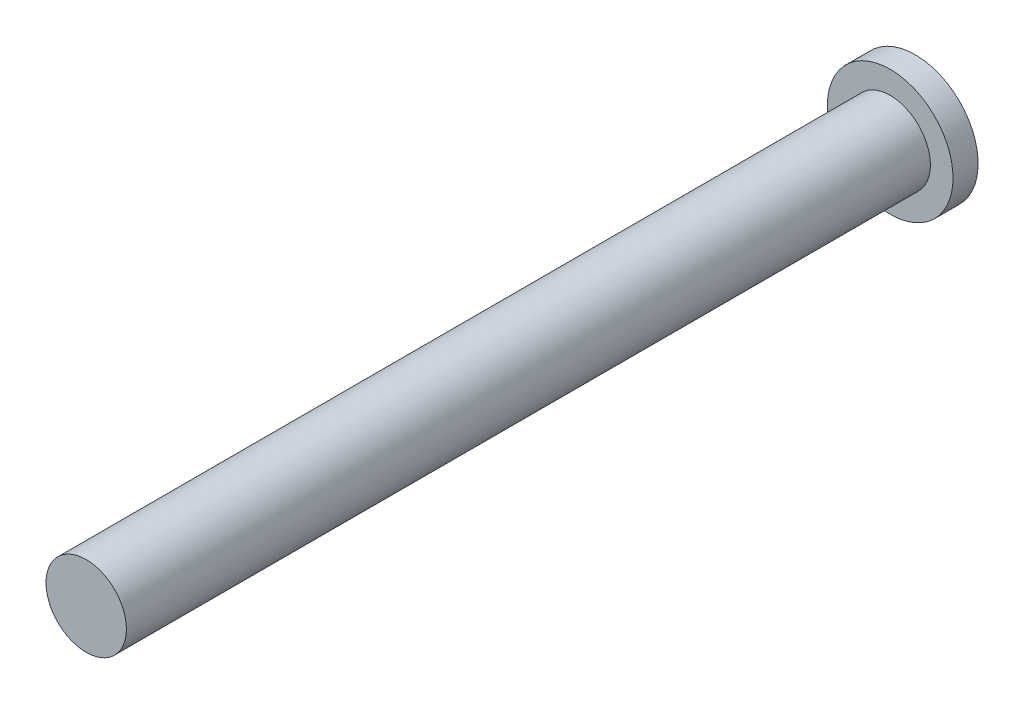
ISO-10303-21;
HEADER;
FILE_DESCRIPTION(('STEP AP214'),'2;1');
FILE_NAME('part.step','',(''),(''),'','','');
FILE_SCHEMA(('AUTOMOTIVE_DESIGN { 1 0 10303 214 1 1 1 1 }'));
ENDSEC;
DATA;
#1=APPLICATION_CONTEXT('core data for automotive mechanical design processes');
#2=APPLICATION_PROTOCOL_DEFINITION('international standard','automotive_design',2000,#1);
#3=PRODUCT_CONTEXT('',#1,'mechanical');
#4=PRODUCT('Part','Part','',(#3));
#5=PRODUCT_RELATED_PRODUCT_CATEGORY('part','',(#4));
#6=PRODUCT_DEFINITION_FORMATION('','',#4);
#7=PRODUCT_DEFINITION_CONTEXT('part definition',#1,'design');
#8=PRODUCT_DEFINITION('design','',#6,#7);
#9=PRODUCT_DEFINITION_SHAPE('','',#8);
#10=(LENGTH_UNIT() NAMED_UNIT(*) SI_UNIT(.MILLI.,.METRE.));
#11=(NAMED_UNIT(*) PLANE_ANGLE_UNIT() SI_UNIT($,.RADIAN.));
#12=(NAMED_UNIT(*) SI_UNIT($,.STERADIAN.) SOLID_ANGLE_UNIT());
#13=UNCERTAINTY_MEASURE_WITH_UNIT(LENGTH_MEASURE(1.E-05),#10,'distance_accuracy_value','');
#14=(GEOMETRIC_REPRESENTATION_CONTEXT(3) GLOBAL_UNCERTAINTY_ASSIGNED_CONTEXT((#13)) GLOBAL_UNIT_ASSIGNED_CONTEXT((#10,
#11,#12)) REPRESENTATION_CONTEXT('',''));
#15=CARTESIAN_POINT('',(0.,0.,0.));
#16=DIRECTION('',(0.,0.,1.));
#17=DIRECTION('',(1.,0.,0.));
#18=AXIS2_PLACEMENT_3D('',#15,#16,#17);
#19=CARTESIAN_POINT('',(0.,0.,32.));
#20=DIRECTION('',(0.,0.,-1.));
#21=DIRECTION('',(-1.,0.,0.));
#22=AXIS2_PLACEMENT_3D('',#19,#20,#21);
#23=CYLINDRICAL_SURFACE('',#22,1.6);
#24=CARTESIAN_POINT('',(0.,0.,32.));
#25=DIRECTION('',(0.,0.,1.));
#26=DIRECTION('',(1.,0.,0.));
#27=AXIS2_PLACEMENT_3D('',#24,#25,#26);
#28=CIRCLE('',#27,1.6);
#29=CARTESIAN_POINT('',(1.6,0.,32.));
#30=VERTEX_POINT('',#29);
#31=EDGE_CURVE('E10',#30,#30,#28,.T.);
#32=ORIENTED_EDGE('',*,*,#31,.F.);
#33=EDGE_LOOP('',(#32));
#34=FACE_BOUND('',#33,.T.);
#35=CARTESIAN_POINT('',(0.,0.,0.));
#36=DIRECTION('',(0.,0.,-1.));
#37=DIRECTION('',(-1.,0.,0.));
#38=AXIS2_PLACEMENT_3D('',#35,#36,#37);
#39=CIRCLE('',#38,1.6);
#40=CARTESIAN_POINT('',(-1.6,0.,0.));
#41=VERTEX_POINT('',#40);
#42=EDGE_CURVE('E37',#41,#41,#39,.T.);
#43=ORIENTED_EDGE('',*,*,#42,.F.);
#44=EDGE_LOOP('',(#43));
#45=FACE_BOUND('',#44,.T.);
#46=ADVANCED_FACE('F31',(#34,#45),#23,.T.);
#47=CARTESIAN_POINT('',(0.,0.,32.));
#48=DIRECTION('',(0.,0.,1.));
#49=DIRECTION('',(1.,0.,0.));
#50=AXIS2_PLACEMENT_3D('',#47,#48,#49);
#51=PLANE('',#50);
#52=ORIENTED_EDGE('',*,*,#31,.T.);
#53=EDGE_LOOP('',(#52));
#54=FACE_BOUND('',#53,.T.);
#55=ADVANCED_FACE('F64',(#54),#51,.T.);
#56=CARTESIAN_POINT('',(0.,0.,-1.));
#57=DIRECTION('',(0.,0.,1.));
#58=DIRECTION('',(1.,0.,0.));
#59=AXIS2_PLACEMENT_3D('',#56,#57,#58);
#60=CYLINDRICAL_SURFACE('',#59,2.5);
#61=CARTESIAN_POINT('',(0.,0.,-1.));
#62=DIRECTION('',(0.,0.,-1.));
#63=DIRECTION('',(-1.,0.,0.));
#64=AXIS2_PLACEMENT_3D('',#61,#62,#63);
#65=CIRCLE('',#64,2.5);
#66=CARTESIAN_POINT('',(-2.5,0.,-1.));
#67=VERTEX_POINT('',#66);
#68=EDGE_CURVE('E41',#67,#67,#65,.T.);
#69=ORIENTED_EDGE('',*,*,#68,.F.);
#70=EDGE_LOOP('',(#69));
#71=FACE_BOUND('',#70,.T.);
#72=CARTESIAN_POINT('',(0.,0.,0.));
#73=DIRECTION('',(0.,0.,-1.));
#74=DIRECTION('',(-1.,0.,0.));
#75=AXIS2_PLACEMENT_3D('',#72,#73,#74);
#76=CIRCLE('',#75,2.5);
#77=CARTESIAN_POINT('',(-2.5,0.,0.));
#78=VERTEX_POINT('',#77);
#79=EDGE_CURVE('E45',#78,#78,#76,.T.);
#80=ORIENTED_EDGE('',*,*,#79,.T.);
#81=EDGE_LOOP('',(#80));
#82=FACE_BOUND('',#81,.T.);
#83=ADVANCED_FACE('F51',(#71,#82),#60,.T.);
#84=CARTESIAN_POINT('',(0.,0.,-1.));
#85=DIRECTION('',(0.,0.,-1.));
#86=DIRECTION('',(-1.,0.,0.));
#87=AXIS2_PLACEMENT_3D('',#84,#85,#86);
#88=PLANE('',#87);
#89=ORIENTED_EDGE('',*,*,#68,.T.);
#90=EDGE_LOOP('',(#89));
#91=FACE_BOUND('',#90,.T.);
#92=ADVANCED_FACE('F55',(#91),#88,.T.);
#93=CARTESIAN_POINT('',(0.,0.,0.));
#94=DIRECTION('',(0.,0.,-1.));
#95=DIRECTION('',(-1.,0.,0.));
#96=AXIS2_PLACEMENT_3D('',#93,#94,#95);
#97=PLANE('',#96);
#98=ORIENTED_EDGE('',*,*,#42,.T.);
#99=EDGE_LOOP('',(#98));
#100=FACE_BOUND('',#99,.T.);
#101=ORIENTED_EDGE('',*,*,#79,.F.);
#102=EDGE_LOOP('',(#101));
#103=FACE_BOUND('',#102,.T.);
#104=ADVANCED_FACE('F53',(#100,#103),#97,.F.);
#105=CLOSED_SHELL('',(#46,#55,#83,#92,#104));
#106=MANIFOLD_SOLID_BREP('B2',#105);
#107=ADVANCED_BREP_SHAPE_REPRESENTATION('',(#18,#106),#14);
#108=SHAPE_DEFINITION_REPRESENTATION(#9,#107);
ENDSEC;
END-ISO-10303-21;
